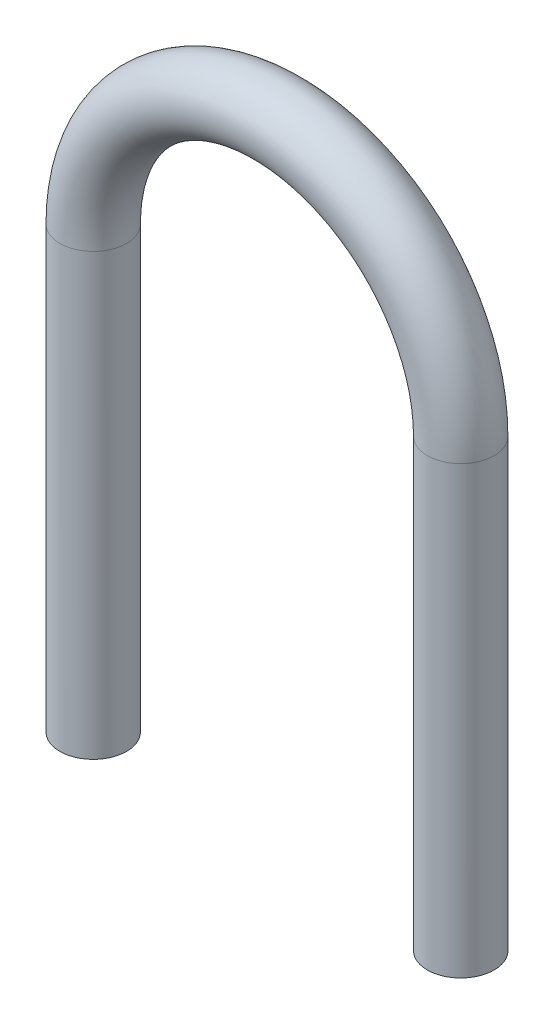
ISO-10303-21;
HEADER;
FILE_DESCRIPTION(('STEP AP214'),'2;1');
FILE_NAME('part.step','',(''),(''),'','','');
FILE_SCHEMA(('AUTOMOTIVE_DESIGN { 1 0 10303 214 1 1 1 1 }'));
ENDSEC;
DATA;
#1=APPLICATION_CONTEXT('core data for automotive mechanical design processes');
#2=APPLICATION_PROTOCOL_DEFINITION('international standard','automotive_design',2000,#1);
#3=PRODUCT_CONTEXT('',#1,'mechanical');
#4=PRODUCT('Part','Part','',(#3));
#5=PRODUCT_RELATED_PRODUCT_CATEGORY('part','',(#4));
#6=PRODUCT_DEFINITION_FORMATION('','',#4);
#7=PRODUCT_DEFINITION_CONTEXT('part definition',#1,'design');
#8=PRODUCT_DEFINITION('design','',#6,#7);
#9=PRODUCT_DEFINITION_SHAPE('','',#8);
#10=(LENGTH_UNIT() NAMED_UNIT(*) SI_UNIT(.MILLI.,.METRE.));
#11=(NAMED_UNIT(*) PLANE_ANGLE_UNIT() SI_UNIT($,.RADIAN.));
#12=(NAMED_UNIT(*) SI_UNIT($,.STERADIAN.) SOLID_ANGLE_UNIT());
#13=UNCERTAINTY_MEASURE_WITH_UNIT(LENGTH_MEASURE(1.E-05),#10,'distance_accuracy_value','');
#14=(GEOMETRIC_REPRESENTATION_CONTEXT(3) GLOBAL_UNCERTAINTY_ASSIGNED_CONTEXT((#13)) GLOBAL_UNIT_ASSIGNED_CONTEXT((#10,
#11,#12)) REPRESENTATION_CONTEXT('',''));
#15=CARTESIAN_POINT('',(0.,0.,0.));
#16=DIRECTION('',(0.,0.,1.));
#17=DIRECTION('',(1.,0.,0.));
#18=AXIS2_PLACEMENT_3D('',#15,#16,#17);
#19=CARTESIAN_POINT('',(16.5,-0.500000000000001,0.));
#20=DIRECTION('',(0.,-1.,0.));
#21=DIRECTION('',(0.,0.,1.));
#22=AXIS2_PLACEMENT_3D('',#19,#20,#21);
#23=PLANE('',#22);
#24=CARTESIAN_POINT('',(16.5,-0.500000000000001,0.));
#25=DIRECTION('',(0.,-1.,0.));
#26=DIRECTION('',(0.,0.,1.));
#27=AXIS2_PLACEMENT_3D('',#24,#25,#26);
#28=CIRCLE('',#27,3.);
#29=CARTESIAN_POINT('',(16.5,-0.500000000000001,3.));
#30=VERTEX_POINT('',#29);
#31=EDGE_CURVE('E57',#30,#30,#28,.T.);
#32=ORIENTED_EDGE('',*,*,#31,.T.);
#33=EDGE_LOOP('',(#32));
#34=FACE_BOUND('',#33,.T.);
#35=ADVANCED_FACE('F43',(#34),#23,.T.);
#36=CARTESIAN_POINT('',(-16.5,0.,0.));
#37=DIRECTION('',(0.,1.,0.));
#38=DIRECTION('',(0.,0.,1.));
#39=AXIS2_PLACEMENT_3D('',#36,#37,#38);
#40=PLANE('',#39);
#41=CARTESIAN_POINT('',(-16.5,0.,0.));
#42=DIRECTION('',(0.,1.,0.));
#43=DIRECTION('',(0.,0.,1.));
#44=AXIS2_PLACEMENT_3D('',#41,#42,#43);
#45=CIRCLE('',#44,3.);
#46=CARTESIAN_POINT('',(-16.5,0.,3.));
#47=VERTEX_POINT('',#46);
#48=EDGE_CURVE('E10',#47,#47,#45,.T.);
#49=ORIENTED_EDGE('',*,*,#48,.F.);
#50=EDGE_LOOP('',(#49));
#51=FACE_BOUND('',#50,.T.);
#52=ADVANCED_FACE('F67',(#51),#40,.F.);
#53=CARTESIAN_POINT('',(16.5,-0.500000000000001,0.));
#54=DIRECTION('',(0.,1.,0.));
#55=DIRECTION('',(0.,0.,1.));
#56=AXIS2_PLACEMENT_3D('',#53,#54,#55);
#57=CYLINDRICAL_SURFACE('',#56,3.);
#58=CARTESIAN_POINT('',(16.5,39.5,0.));
#59=DIRECTION('',(0.,-1.,0.));
#60=DIRECTION('',(0.,0.,1.));
#61=AXIS2_PLACEMENT_3D('',#58,#59,#60);
#62=CIRCLE('',#61,3.);
#63=CARTESIAN_POINT('',(19.5,39.5,0.));
#64=VERTEX_POINT('',#63);
#65=EDGE_CURVE('E53',#64,#64,#62,.T.);
#66=ORIENTED_EDGE('',*,*,#65,.T.);
#67=EDGE_LOOP('',(#66));
#68=FACE_BOUND('',#67,.T.);
#69=ORIENTED_EDGE('',*,*,#31,.F.);
#70=EDGE_LOOP('',(#69));
#71=FACE_BOUND('',#70,.T.);
#72=ADVANCED_FACE('F64',(#68,#71),#57,.T.);
#73=CARTESIAN_POINT('',(0.,39.5,0.));
#74=DIRECTION('',(0.,0.,1.));
#75=DIRECTION('',(1.,0.,0.));
#76=AXIS2_PLACEMENT_3D('',#73,#74,#75);
#77=TOROIDAL_SURFACE('',#76,16.5,3.);
#78=CARTESIAN_POINT('',(-16.5,39.5,0.));
#79=DIRECTION('',(0.,1.,0.));
#80=DIRECTION('',(0.,0.,1.));
#81=AXIS2_PLACEMENT_3D('',#78,#79,#80);
#82=CIRCLE('',#81,3.);
#83=CARTESIAN_POINT('',(-19.5,39.5,0.));
#84=VERTEX_POINT('',#83);
#85=EDGE_CURVE('E49',#84,#84,#82,.T.);
#86=CARTESIAN_POINT('',(0.,39.5,0.));
#87=DIRECTION('',(0.,0.,1.));
#88=DIRECTION('',(1.,0.,0.));
#89=AXIS2_PLACEMENT_3D('',#86,#87,#88);
#90=CIRCLE('',#89,19.5);
#91=EDGE_CURVE('',#64,#84,#90,.T.);
#92=ORIENTED_EDGE('',*,*,#65,.F.);
#93=ORIENTED_EDGE('',*,*,#85,.T.);
#94=ORIENTED_EDGE('',*,*,#91,.T.);
#95=ORIENTED_EDGE('',*,*,#91,.F.);
#96=EDGE_LOOP('',(#92,#94,#93,#95));
#97=FACE_BOUND('',#96,.T.);
#98=ADVANCED_FACE('F66',(#97),#77,.T.);
#99=CARTESIAN_POINT('',(-16.5,39.5,0.));
#100=DIRECTION('',(0.,-1.,0.));
#101=DIRECTION('',(0.,0.,-1.));
#102=AXIS2_PLACEMENT_3D('',#99,#100,#101);
#103=CYLINDRICAL_SURFACE('',#102,3.);
#104=ORIENTED_EDGE('',*,*,#48,.T.);
#105=EDGE_LOOP('',(#104));
#106=FACE_BOUND('',#105,.T.);
#107=ORIENTED_EDGE('',*,*,#85,.F.);
#108=EDGE_LOOP('',(#107));
#109=FACE_BOUND('',#108,.T.);
#110=ADVANCED_FACE('F74',(#106,#109),#103,.T.);
#111=CLOSED_SHELL('',(#35,#52,#72,#98,#110));
#112=MANIFOLD_SOLID_BREP('B2',#111);
#113=ADVANCED_BREP_SHAPE_REPRESENTATION('',(#18,#112),#14);
#114=SHAPE_DEFINITION_REPRESENTATION(#9,#113);
ENDSEC;
END-ISO-10303-21;
